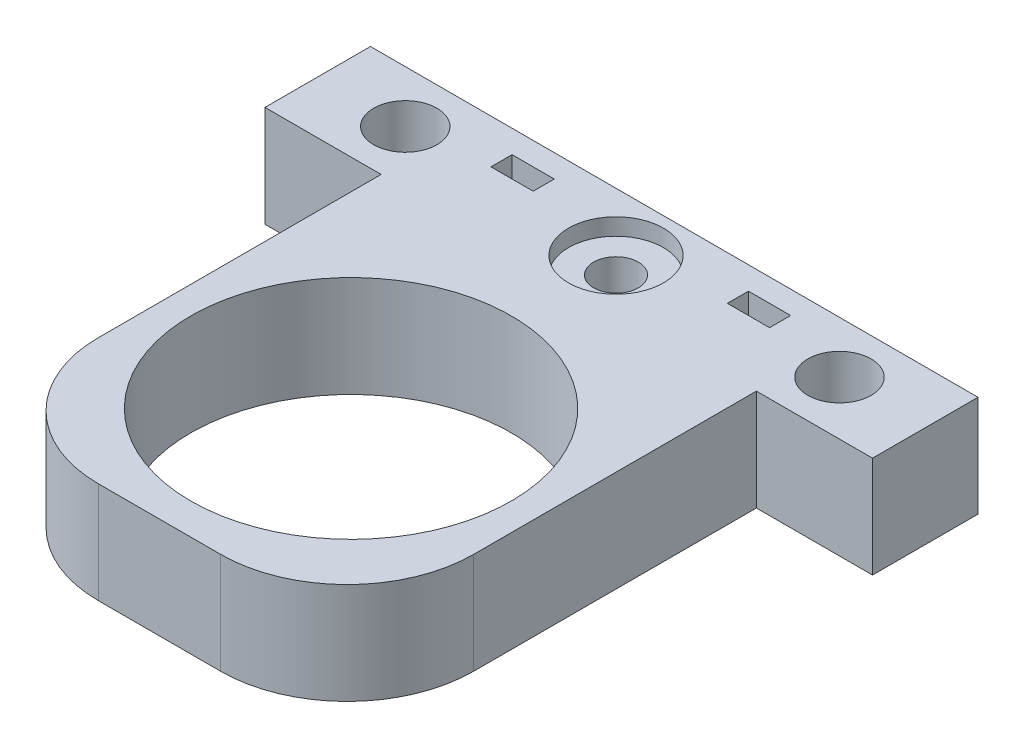
ISO-10303-21;
HEADER;
FILE_DESCRIPTION(('STEP AP214'),'2;1');
FILE_NAME('part.step','',(''),(''),'','','');
FILE_SCHEMA(('AUTOMOTIVE_DESIGN { 1 0 10303 214 1 1 1 1 }'));
ENDSEC;
DATA;
#1=APPLICATION_CONTEXT('core data for automotive mechanical design processes');
#2=APPLICATION_PROTOCOL_DEFINITION('international standard','automotive_design',2000,#1);
#3=PRODUCT_CONTEXT('',#1,'mechanical');
#4=PRODUCT('Part','Part','',(#3));
#5=PRODUCT_RELATED_PRODUCT_CATEGORY('part','',(#4));
#6=PRODUCT_DEFINITION_FORMATION('','',#4);
#7=PRODUCT_DEFINITION_CONTEXT('part definition',#1,'design');
#8=PRODUCT_DEFINITION('design','',#6,#7);
#9=PRODUCT_DEFINITION_SHAPE('','',#8);
#10=(LENGTH_UNIT() NAMED_UNIT(*) SI_UNIT(.MILLI.,.METRE.));
#11=(NAMED_UNIT(*) PLANE_ANGLE_UNIT() SI_UNIT($,.RADIAN.));
#12=(NAMED_UNIT(*) SI_UNIT($,.STERADIAN.) SOLID_ANGLE_UNIT());
#13=UNCERTAINTY_MEASURE_WITH_UNIT(LENGTH_MEASURE(1.E-05),#10,'distance_accuracy_value','');
#14=(GEOMETRIC_REPRESENTATION_CONTEXT(3) GLOBAL_UNCERTAINTY_ASSIGNED_CONTEXT((#13)) GLOBAL_UNIT_ASSIGNED_CONTEXT((#10,
#11,#12)) REPRESENTATION_CONTEXT('',''));
#15=CARTESIAN_POINT('',(0.,0.,0.));
#16=DIRECTION('',(0.,0.,1.));
#17=DIRECTION('',(1.,0.,0.));
#18=AXIS2_PLACEMENT_3D('',#15,#16,#17);
#19=CARTESIAN_POINT('',(0.,20.,-11.2));
#20=DIRECTION('',(0.,1.,0.));
#21=DIRECTION('',(0.,0.,1.));
#22=AXIS2_PLACEMENT_3D('',#19,#20,#21);
#23=CYLINDRICAL_SURFACE('',#22,5.3);
#24=CARTESIAN_POINT('',(0.,20.,-11.2));
#25=DIRECTION('',(0.,1.,0.));
#26=DIRECTION('',(0.,0.,1.));
#27=AXIS2_PLACEMENT_3D('',#24,#25,#26);
#28=CIRCLE('',#27,5.3);
#29=CARTESIAN_POINT('',(0.,20.,-5.90000000000002));
#30=VERTEX_POINT('',#29);
#31=EDGE_CURVE('E175',#30,#30,#28,.T.);
#32=ORIENTED_EDGE('',*,*,#31,.F.);
#33=EDGE_LOOP('',(#32));
#34=FACE_BOUND('',#33,.T.);
#35=CARTESIAN_POINT('',(0.,40.,-11.2));
#36=DIRECTION('',(0.,1.,0.));
#37=DIRECTION('',(0.,0.,1.));
#38=AXIS2_PLACEMENT_3D('',#35,#36,#37);
#39=CIRCLE('',#38,5.3);
#40=CARTESIAN_POINT('',(0.,40.,-5.90000000000002));
#41=VERTEX_POINT('',#40);
#42=EDGE_CURVE('E301',#41,#41,#39,.F.);
#43=ORIENTED_EDGE('',*,*,#42,.F.);
#44=EDGE_LOOP('',(#43));
#45=FACE_BOUND('',#44,.T.);
#46=ADVANCED_FACE('F39',(#34,#45),#23,.F.);
#47=CARTESIAN_POINT('',(-65.,60.,-25.));
#48=DIRECTION('',(0.,0.,1.));
#49=DIRECTION('',(1.,0.,0.));
#50=AXIS2_PLACEMENT_3D('',#47,#48,#49);
#51=PLANE('',#50);
#52=DIRECTION('',(-1.,0.,0.));
#53=VECTOR('',#52,1.);
#54=CARTESIAN_POINT('',(-72.,44.,-25.));
#55=LINE('',#54,#53);
#56=CARTESIAN_POINT('',(72.,44.,-25.));
#57=VERTEX_POINT('',#56);
#58=CARTESIAN_POINT('',(-72.,44.,-25.));
#59=VERTEX_POINT('',#58);
#60=EDGE_CURVE('E170',#57,#59,#55,.T.);
#61=ORIENTED_EDGE('',*,*,#60,.F.);
#62=DIRECTION('',(0.,1.,0.));
#63=VECTOR('',#62,1.);
#64=CARTESIAN_POINT('',(72.,60.,-25.));
#65=LINE('',#64,#63);
#66=CARTESIAN_POINT('',(72.,20.,-25.));
#67=VERTEX_POINT('',#66);
#68=EDGE_CURVE('E206',#67,#57,#65,.T.);
#69=ORIENTED_EDGE('',*,*,#68,.F.);
#70=DIRECTION('',(1.,0.,0.));
#71=VECTOR('',#70,1.);
#72=CARTESIAN_POINT('',(-65.,20.,-25.));
#73=LINE('',#72,#71);
#74=CARTESIAN_POINT('',(-72.,20.,-25.));
#75=VERTEX_POINT('',#74);
#76=EDGE_CURVE('E217',#75,#67,#73,.T.);
#77=ORIENTED_EDGE('',*,*,#76,.F.);
#78=DIRECTION('',(0.,-1.,0.));
#79=VECTOR('',#78,1.);
#80=CARTESIAN_POINT('',(-72.,60.,-25.));
#81=LINE('',#80,#79);
#82=EDGE_CURVE('E199',#59,#75,#81,.T.);
#83=ORIENTED_EDGE('',*,*,#82,.F.);
#84=EDGE_LOOP('',(#61,#69,#77,#83));
#85=FACE_BOUND('',#84,.T.);
#86=ADVANCED_FACE('F350',(#85),#51,.F.);
#87=CARTESIAN_POINT('',(51.4526055476511,0.,-12.7142223868873));
#88=DIRECTION('',(0.,1.,0.));
#89=DIRECTION('',(0.,0.,1.));
#90=AXIS2_PLACEMENT_3D('',#87,#88,#89);
#91=CYLINDRICAL_SURFACE('',#90,7.5);
#92=CARTESIAN_POINT('',(51.4526055476511,20.,-12.7142223868873));
#93=DIRECTION('',(0.,-1.,0.));
#94=DIRECTION('',(0.,0.,-1.));
#95=AXIS2_PLACEMENT_3D('',#92,#93,#94);
#96=CIRCLE('',#95,7.5);
#97=CARTESIAN_POINT('',(51.4526055476511,20.,-20.2142223868873));
#98=VERTEX_POINT('',#97);
#99=EDGE_CURVE('E251',#98,#98,#96,.F.);
#100=ORIENTED_EDGE('',*,*,#99,.F.);
#101=EDGE_LOOP('',(#100));
#102=FACE_BOUND('',#101,.T.);
#103=CARTESIAN_POINT('',(51.4526055476511,44.,-12.7142223868873));
#104=DIRECTION('',(0.,1.,0.));
#105=DIRECTION('',(0.,0.,1.));
#106=AXIS2_PLACEMENT_3D('',#103,#104,#105);
#107=CIRCLE('',#106,7.5);
#108=CARTESIAN_POINT('',(51.4526055476511,44.,-5.21422238688734));
#109=VERTEX_POINT('',#108);
#110=EDGE_CURVE('E392',#109,#109,#107,.F.);
#111=ORIENTED_EDGE('',*,*,#110,.F.);
#112=EDGE_LOOP('',(#111));
#113=FACE_BOUND('',#112,.T.);
#114=ADVANCED_FACE('F399',(#102,#113),#91,.F.);
#115=CARTESIAN_POINT('',(-51.4526055476511,0.,-12.7142223868873));
#116=DIRECTION('',(0.,1.,0.));
#117=DIRECTION('',(0.,0.,1.));
#118=AXIS2_PLACEMENT_3D('',#115,#116,#117);
#119=CYLINDRICAL_SURFACE('',#118,7.5);
#120=CARTESIAN_POINT('',(-51.4526055476511,20.,-12.7142223868873));
#121=DIRECTION('',(0.,-1.,0.));
#122=DIRECTION('',(0.,0.,-1.));
#123=AXIS2_PLACEMENT_3D('',#120,#121,#122);
#124=CIRCLE('',#123,7.5);
#125=CARTESIAN_POINT('',(-51.4526055476511,20.,-20.2142223868873));
#126=VERTEX_POINT('',#125);
#127=EDGE_CURVE('E247',#126,#126,#124,.F.);
#128=ORIENTED_EDGE('',*,*,#127,.F.);
#129=EDGE_LOOP('',(#128));
#130=FACE_BOUND('',#129,.T.);
#131=CARTESIAN_POINT('',(-51.4526055476511,44.,-12.7142223868873));
#132=DIRECTION('',(0.,1.,0.));
#133=DIRECTION('',(0.,0.,1.));
#134=AXIS2_PLACEMENT_3D('',#131,#132,#133);
#135=CIRCLE('',#134,7.5);
#136=CARTESIAN_POINT('',(-51.4526055476511,44.,-5.21422238688734));
#137=VERTEX_POINT('',#136);
#138=EDGE_CURVE('E388',#137,#137,#135,.F.);
#139=ORIENTED_EDGE('',*,*,#138,.F.);
#140=EDGE_LOOP('',(#139));
#141=FACE_BOUND('',#140,.T.);
#142=ADVANCED_FACE('F401',(#130,#141),#119,.F.);
#143=CARTESIAN_POINT('',(-33.01308524261,0.,-19.5794065637342));
#144=DIRECTION('',(-1.,0.,0.));
#145=DIRECTION('',(0.,0.,1.));
#146=AXIS2_PLACEMENT_3D('',#143,#144,#145);
#147=PLANE('',#146);
#148=DIRECTION('',(0.,0.,-1.));
#149=VECTOR('',#148,1.);
#150=CARTESIAN_POINT('',(-33.01308524261,44.,-19.5794065637342));
#151=LINE('',#150,#149);
#152=CARTESIAN_POINT('',(-33.01308524261,44.,-14.5794065637342));
#153=VERTEX_POINT('',#152);
#154=CARTESIAN_POINT('',(-33.01308524261,44.,-19.5794065637342));
#155=VERTEX_POINT('',#154);
#156=EDGE_CURVE('E385',#153,#155,#151,.T.);
#157=ORIENTED_EDGE('',*,*,#156,.F.);
#158=DIRECTION('',(0.,1.,0.));
#159=VECTOR('',#158,1.);
#160=CARTESIAN_POINT('',(-33.01308524261,0.,-14.5794065637342));
#161=LINE('',#160,#159);
#162=CARTESIAN_POINT('',(-33.01308524261,20.,-14.5794065637342));
#163=VERTEX_POINT('',#162);
#164=EDGE_CURVE('E260',#163,#153,#161,.T.);
#165=ORIENTED_EDGE('',*,*,#164,.F.);
#166=DIRECTION('',(0.,0.,1.));
#167=VECTOR('',#166,1.);
#168=CARTESIAN_POINT('',(-33.01308524261,20.,-19.5794065637342));
#169=LINE('',#168,#167);
#170=CARTESIAN_POINT('',(-33.01308524261,20.,-19.5794065637342));
#171=VERTEX_POINT('',#170);
#172=EDGE_CURVE('E244',#171,#163,#169,.T.);
#173=ORIENTED_EDGE('',*,*,#172,.F.);
#174=DIRECTION('',(0.,1.,0.));
#175=VECTOR('',#174,1.);
#176=CARTESIAN_POINT('',(-33.01308524261,0.,-19.5794065637342));
#177=LINE('',#176,#175);
#178=EDGE_CURVE('E272',#171,#155,#177,.T.);
#179=ORIENTED_EDGE('',*,*,#178,.T.);
#180=EDGE_LOOP('',(#157,#165,#173,#179));
#181=FACE_BOUND('',#180,.T.);
#182=ADVANCED_FACE('F408',(#181),#147,.F.);
#183=CARTESIAN_POINT('',(-33.01308524261,0.,-19.5794065637342));
#184=DIRECTION('',(0.,0.,-1.));
#185=DIRECTION('',(-1.,0.,0.));
#186=AXIS2_PLACEMENT_3D('',#183,#184,#185);
#187=PLANE('',#186);
#188=DIRECTION('',(1.,0.,0.));
#189=VECTOR('',#188,1.);
#190=CARTESIAN_POINT('',(-33.01308524261,44.,-19.5794065637342));
#191=LINE('',#190,#189);
#192=CARTESIAN_POINT('',(-23.01308524261,44.,-19.5794065637342));
#193=VERTEX_POINT('',#192);
#194=EDGE_CURVE('E382',#155,#193,#191,.T.);
#195=ORIENTED_EDGE('',*,*,#194,.F.);
#196=ORIENTED_EDGE('',*,*,#178,.F.);
#197=DIRECTION('',(-1.,0.,0.));
#198=VECTOR('',#197,1.);
#199=CARTESIAN_POINT('',(-33.01308524261,20.,-19.5794065637342));
#200=LINE('',#199,#198);
#201=CARTESIAN_POINT('',(-23.01308524261,20.,-19.5794065637342));
#202=VERTEX_POINT('',#201);
#203=EDGE_CURVE('E241',#202,#171,#200,.T.);
#204=ORIENTED_EDGE('',*,*,#203,.F.);
#205=DIRECTION('',(0.,1.,0.));
#206=VECTOR('',#205,1.);
#207=CARTESIAN_POINT('',(-23.01308524261,0.,-19.5794065637342));
#208=LINE('',#207,#206);
#209=EDGE_CURVE('E277',#202,#193,#208,.T.);
#210=ORIENTED_EDGE('',*,*,#209,.T.);
#211=EDGE_LOOP('',(#195,#196,#204,#210));
#212=FACE_BOUND('',#211,.T.);
#213=ADVANCED_FACE('F467',(#212),#187,.F.);
#214=CARTESIAN_POINT('',(-23.01308524261,0.,-19.5794065637342));
#215=DIRECTION('',(1.,0.,0.));
#216=DIRECTION('',(0.,0.,-1.));
#217=AXIS2_PLACEMENT_3D('',#214,#215,#216);
#218=PLANE('',#217);
#219=DIRECTION('',(0.,0.,1.));
#220=VECTOR('',#219,1.);
#221=CARTESIAN_POINT('',(-23.01308524261,44.,-19.5794065637342));
#222=LINE('',#221,#220);
#223=CARTESIAN_POINT('',(-23.01308524261,44.,-14.5794065637342));
#224=VERTEX_POINT('',#223);
#225=EDGE_CURVE('E379',#193,#224,#222,.T.);
#226=ORIENTED_EDGE('',*,*,#225,.F.);
#227=ORIENTED_EDGE('',*,*,#209,.F.);
#228=DIRECTION('',(0.,0.,-1.));
#229=VECTOR('',#228,1.);
#230=CARTESIAN_POINT('',(-23.01308524261,20.,-19.5794065637342));
#231=LINE('',#230,#229);
#232=CARTESIAN_POINT('',(-23.01308524261,20.,-14.5794065637342));
#233=VERTEX_POINT('',#232);
#234=EDGE_CURVE('E238',#233,#202,#231,.T.);
#235=ORIENTED_EDGE('',*,*,#234,.F.);
#236=DIRECTION('',(0.,1.,0.));
#237=VECTOR('',#236,1.);
#238=CARTESIAN_POINT('',(-23.01308524261,0.,-14.5794065637342));
#239=LINE('',#238,#237);
#240=EDGE_CURVE('E281',#233,#224,#239,.T.);
#241=ORIENTED_EDGE('',*,*,#240,.T.);
#242=EDGE_LOOP('',(#226,#227,#235,#241));
#243=FACE_BOUND('',#242,.T.);
#244=ADVANCED_FACE('F470',(#243),#218,.F.);
#245=CARTESIAN_POINT('',(-33.01308524261,0.,-14.5794065637342));
#246=DIRECTION('',(0.,0.,1.));
#247=DIRECTION('',(1.,0.,0.));
#248=AXIS2_PLACEMENT_3D('',#245,#246,#247);
#249=PLANE('',#248);
#250=DIRECTION('',(-1.,0.,0.));
#251=VECTOR('',#250,1.);
#252=CARTESIAN_POINT('',(-33.01308524261,44.,-14.5794065637342));
#253=LINE('',#252,#251);
#254=EDGE_CURVE('E376',#224,#153,#253,.T.);
#255=ORIENTED_EDGE('',*,*,#254,.F.);
#256=ORIENTED_EDGE('',*,*,#240,.F.);
#257=DIRECTION('',(1.,0.,0.));
#258=VECTOR('',#257,1.);
#259=CARTESIAN_POINT('',(-33.01308524261,20.,-14.5794065637342));
#260=LINE('',#259,#258);
#261=EDGE_CURVE('E235',#163,#233,#260,.T.);
#262=ORIENTED_EDGE('',*,*,#261,.F.);
#263=ORIENTED_EDGE('',*,*,#164,.T.);
#264=EDGE_LOOP('',(#255,#256,#262,#263));
#265=FACE_BOUND('',#264,.T.);
#266=ADVANCED_FACE('F465',(#265),#249,.F.);
#267=CARTESIAN_POINT('',(33.01308524261,0.,-19.5794065637342));
#268=DIRECTION('',(0.,0.,-1.));
#269=DIRECTION('',(-1.,0.,0.));
#270=AXIS2_PLACEMENT_3D('',#267,#268,#269);
#271=PLANE('',#270);
#272=DIRECTION('',(1.,0.,0.));
#273=VECTOR('',#272,1.);
#274=CARTESIAN_POINT('',(33.01308524261,44.,-19.5794065637342));
#275=LINE('',#274,#273);
#276=CARTESIAN_POINT('',(23.01308524261,44.,-19.5794065637342));
#277=VERTEX_POINT('',#276);
#278=CARTESIAN_POINT('',(33.01308524261,44.,-19.5794065637342));
#279=VERTEX_POINT('',#278);
#280=EDGE_CURVE('E373',#277,#279,#275,.T.);
#281=ORIENTED_EDGE('',*,*,#280,.F.);
#282=DIRECTION('',(0.,1.,0.));
#283=VECTOR('',#282,1.);
#284=CARTESIAN_POINT('',(23.01308524261,0.,-19.5794065637342));
#285=LINE('',#284,#283);
#286=CARTESIAN_POINT('',(23.01308524261,20.,-19.5794065637342));
#287=VERTEX_POINT('',#286);
#288=EDGE_CURVE('E255',#287,#277,#285,.T.);
#289=ORIENTED_EDGE('',*,*,#288,.F.);
#290=DIRECTION('',(-1.,0.,0.));
#291=VECTOR('',#290,1.);
#292=CARTESIAN_POINT('',(33.01308524261,20.,-19.5794065637342));
#293=LINE('',#292,#291);
#294=CARTESIAN_POINT('',(33.01308524261,20.,-19.5794065637342));
#295=VERTEX_POINT('',#294);
#296=EDGE_CURVE('E232',#295,#287,#293,.T.);
#297=ORIENTED_EDGE('',*,*,#296,.F.);
#298=DIRECTION('',(0.,1.,0.));
#299=VECTOR('',#298,1.);
#300=CARTESIAN_POINT('',(33.01308524261,0.,-19.5794065637342));
#301=LINE('',#300,#299);
#302=EDGE_CURVE('E256',#295,#279,#301,.T.);
#303=ORIENTED_EDGE('',*,*,#302,.T.);
#304=EDGE_LOOP('',(#281,#289,#297,#303));
#305=FACE_BOUND('',#304,.T.);
#306=ADVANCED_FACE('F455',(#305),#271,.F.);
#307=CARTESIAN_POINT('',(33.01308524261,0.,-19.5794065637342));
#308=DIRECTION('',(1.,0.,0.));
#309=DIRECTION('',(0.,0.,-1.));
#310=AXIS2_PLACEMENT_3D('',#307,#308,#309);
#311=PLANE('',#310);
#312=DIRECTION('',(0.,0.,1.));
#313=VECTOR('',#312,1.);
#314=CARTESIAN_POINT('',(33.01308524261,44.,-19.5794065637342));
#315=LINE('',#314,#313);
#316=CARTESIAN_POINT('',(33.01308524261,44.,-14.5794065637342));
#317=VERTEX_POINT('',#316);
#318=EDGE_CURVE('E370',#279,#317,#315,.T.);
#319=ORIENTED_EDGE('',*,*,#318,.F.);
#320=ORIENTED_EDGE('',*,*,#302,.F.);
#321=DIRECTION('',(0.,0.,-1.));
#322=VECTOR('',#321,1.);
#323=CARTESIAN_POINT('',(33.01308524261,20.,-19.5794065637342));
#324=LINE('',#323,#322);
#325=CARTESIAN_POINT('',(33.01308524261,20.,-14.5794065637342));
#326=VERTEX_POINT('',#325);
#327=EDGE_CURVE('E229',#326,#295,#324,.T.);
#328=ORIENTED_EDGE('',*,*,#327,.F.);
#329=DIRECTION('',(0.,1.,0.));
#330=VECTOR('',#329,1.);
#331=CARTESIAN_POINT('',(33.01308524261,0.,-14.5794065637342));
#332=LINE('',#331,#330);
#333=EDGE_CURVE('E261',#326,#317,#332,.T.);
#334=ORIENTED_EDGE('',*,*,#333,.T.);
#335=EDGE_LOOP('',(#319,#320,#328,#334));
#336=FACE_BOUND('',#335,.T.);
#337=ADVANCED_FACE('F451',(#336),#311,.F.);
#338=CARTESIAN_POINT('',(33.01308524261,0.,-14.5794065637342));
#339=DIRECTION('',(0.,0.,1.));
#340=DIRECTION('',(1.,0.,0.));
#341=AXIS2_PLACEMENT_3D('',#338,#339,#340);
#342=PLANE('',#341);
#343=DIRECTION('',(-1.,0.,0.));
#344=VECTOR('',#343,1.);
#345=CARTESIAN_POINT('',(33.01308524261,44.,-14.5794065637342));
#346=LINE('',#345,#344);
#347=CARTESIAN_POINT('',(23.01308524261,44.,-14.5794065637342));
#348=VERTEX_POINT('',#347);
#349=EDGE_CURVE('E367',#317,#348,#346,.T.);
#350=ORIENTED_EDGE('',*,*,#349,.F.);
#351=ORIENTED_EDGE('',*,*,#333,.F.);
#352=DIRECTION('',(1.,0.,0.));
#353=VECTOR('',#352,1.);
#354=CARTESIAN_POINT('',(33.01308524261,20.,-14.5794065637342));
#355=LINE('',#354,#353);
#356=CARTESIAN_POINT('',(23.01308524261,20.,-14.5794065637342));
#357=VERTEX_POINT('',#356);
#358=EDGE_CURVE('E226',#357,#326,#355,.T.);
#359=ORIENTED_EDGE('',*,*,#358,.F.);
#360=DIRECTION('',(0.,1.,0.));
#361=VECTOR('',#360,1.);
#362=CARTESIAN_POINT('',(23.01308524261,0.,-14.5794065637342));
#363=LINE('',#362,#361);
#364=EDGE_CURVE('E265',#357,#348,#363,.T.);
#365=ORIENTED_EDGE('',*,*,#364,.T.);
#366=EDGE_LOOP('',(#350,#351,#359,#365));
#367=FACE_BOUND('',#366,.T.);
#368=ADVANCED_FACE('F454',(#367),#342,.F.);
#369=CARTESIAN_POINT('',(23.01308524261,0.,-19.5794065637342));
#370=DIRECTION('',(-1.,0.,0.));
#371=DIRECTION('',(0.,0.,1.));
#372=AXIS2_PLACEMENT_3D('',#369,#370,#371);
#373=PLANE('',#372);
#374=DIRECTION('',(0.,0.,-1.));
#375=VECTOR('',#374,1.);
#376=CARTESIAN_POINT('',(23.01308524261,44.,-19.5794065637342));
#377=LINE('',#376,#375);
#378=EDGE_CURVE('E185',#348,#277,#377,.T.);
#379=ORIENTED_EDGE('',*,*,#378,.F.);
#380=ORIENTED_EDGE('',*,*,#364,.F.);
#381=DIRECTION('',(0.,0.,1.));
#382=VECTOR('',#381,1.);
#383=CARTESIAN_POINT('',(23.01308524261,20.,-19.5794065637342));
#384=LINE('',#383,#382);
#385=EDGE_CURVE('E223',#287,#357,#384,.T.);
#386=ORIENTED_EDGE('',*,*,#385,.F.);
#387=ORIENTED_EDGE('',*,*,#288,.T.);
#388=EDGE_LOOP('',(#379,#380,#386,#387));
#389=FACE_BOUND('',#388,.T.);
#390=ADVANCED_FACE('F443',(#389),#373,.F.);
#391=CARTESIAN_POINT('',(44.4743587222466,15.,0.));
#392=DIRECTION('',(-1.,0.,0.));
#393=DIRECTION('',(0.,0.,1.));
#394=AXIS2_PLACEMENT_3D('',#391,#392,#393);
#395=PLANE('',#394);
#396=DIRECTION('',(0.,0.,-1.));
#397=VECTOR('',#396,1.);
#398=CARTESIAN_POINT('',(44.4743587222466,44.,0.));
#399=LINE('',#398,#397);
#400=CARTESIAN_POINT('',(44.4743587222466,44.,67.));
#401=VERTEX_POINT('',#400);
#402=CARTESIAN_POINT('',(44.4743587222466,44.,0.));
#403=VERTEX_POINT('',#402);
#404=EDGE_CURVE('E333',#401,#403,#399,.T.);
#405=ORIENTED_EDGE('',*,*,#404,.F.);
#406=DIRECTION('',(0.,1.,0.));
#407=VECTOR('',#406,1.);
#408=CARTESIAN_POINT('',(44.4743587222466,20.,67.));
#409=LINE('',#408,#407);
#410=CARTESIAN_POINT('',(44.4743587222466,20.,67.));
#411=VERTEX_POINT('',#410);
#412=EDGE_CURVE('E11',#401,#411,#409,.F.);
#413=ORIENTED_EDGE('',*,*,#412,.T.);
#414=DIRECTION('',(0.,0.,-1.));
#415=VECTOR('',#414,1.);
#416=CARTESIAN_POINT('',(44.4743587222466,20.,0.));
#417=LINE('',#416,#415);
#418=CARTESIAN_POINT('',(44.4743587222466,20.,0.));
#419=VERTEX_POINT('',#418);
#420=EDGE_CURVE('E291',#411,#419,#417,.T.);
#421=ORIENTED_EDGE('',*,*,#420,.T.);
#422=DIRECTION('',(0.,1.,0.));
#423=VECTOR('',#422,1.);
#424=CARTESIAN_POINT('',(44.4743587222466,15.,0.));
#425=LINE('',#424,#423);
#426=EDGE_CURVE('E214',#419,#403,#425,.T.);
#427=ORIENTED_EDGE('',*,*,#426,.T.);
#428=EDGE_LOOP('',(#405,#413,#421,#427));
#429=FACE_BOUND('',#428,.T.);
#430=ADVANCED_FACE('F440',(#429),#395,.F.);
#431=CARTESIAN_POINT('',(65.,15.,0.));
#432=DIRECTION('',(0.,0.,-1.));
#433=DIRECTION('',(-1.,0.,0.));
#434=AXIS2_PLACEMENT_3D('',#431,#432,#433);
#435=PLANE('',#434);
#436=DIRECTION('',(1.,0.,0.));
#437=VECTOR('',#436,1.);
#438=CARTESIAN_POINT('',(65.,44.,0.));
#439=LINE('',#438,#437);
#440=CARTESIAN_POINT('',(72.,44.,0.));
#441=VERTEX_POINT('',#440);
#442=EDGE_CURVE('E355',#403,#441,#439,.T.);
#443=ORIENTED_EDGE('',*,*,#442,.F.);
#444=ORIENTED_EDGE('',*,*,#426,.F.);
#445=DIRECTION('',(1.,0.,0.));
#446=VECTOR('',#445,1.);
#447=CARTESIAN_POINT('',(0.,20.,0.));
#448=LINE('',#447,#446);
#449=CARTESIAN_POINT('',(72.,20.,0.));
#450=VERTEX_POINT('',#449);
#451=EDGE_CURVE('E276',#419,#450,#448,.T.);
#452=ORIENTED_EDGE('',*,*,#451,.T.);
#453=DIRECTION('',(0.,-1.,0.));
#454=VECTOR('',#453,1.);
#455=CARTESIAN_POINT('',(72.,60.,0.));
#456=LINE('',#455,#454);
#457=EDGE_CURVE('E193',#441,#450,#456,.T.);
#458=ORIENTED_EDGE('',*,*,#457,.F.);
#459=EDGE_LOOP('',(#443,#444,#452,#458));
#460=FACE_BOUND('',#459,.T.);
#461=ADVANCED_FACE('F437',(#460),#435,.F.);
#462=CARTESIAN_POINT('',(-65.,15.,0.));
#463=DIRECTION('',(0.,0.,-1.));
#464=DIRECTION('',(-1.,0.,0.));
#465=AXIS2_PLACEMENT_3D('',#462,#463,#464);
#466=PLANE('',#465);
#467=DIRECTION('',(1.,0.,0.));
#468=VECTOR('',#467,1.);
#469=CARTESIAN_POINT('',(-65.,44.,0.));
#470=LINE('',#469,#468);
#471=CARTESIAN_POINT('',(-72.,44.,0.));
#472=VERTEX_POINT('',#471);
#473=CARTESIAN_POINT('',(-44.4743587222466,44.,0.));
#474=VERTEX_POINT('',#473);
#475=EDGE_CURVE('E168',#472,#474,#470,.T.);
#476=ORIENTED_EDGE('',*,*,#475,.F.);
#477=DIRECTION('',(0.,1.,0.));
#478=VECTOR('',#477,1.);
#479=CARTESIAN_POINT('',(-72.,60.,0.));
#480=LINE('',#479,#478);
#481=CARTESIAN_POINT('',(-72.,20.,0.));
#482=VERTEX_POINT('',#481);
#483=EDGE_CURVE('E182',#482,#472,#480,.T.);
#484=ORIENTED_EDGE('',*,*,#483,.F.);
#485=DIRECTION('',(1.,0.,0.));
#486=VECTOR('',#485,1.);
#487=CARTESIAN_POINT('',(0.,20.,0.));
#488=LINE('',#487,#486);
#489=CARTESIAN_POINT('',(-44.4743587222466,20.,0.));
#490=VERTEX_POINT('',#489);
#491=EDGE_CURVE('E297',#482,#490,#488,.T.);
#492=ORIENTED_EDGE('',*,*,#491,.T.);
#493=DIRECTION('',(0.,1.,0.));
#494=VECTOR('',#493,1.);
#495=CARTESIAN_POINT('',(-44.4743587222466,15.,0.));
#496=LINE('',#495,#494);
#497=EDGE_CURVE('E183',#490,#474,#496,.T.);
#498=ORIENTED_EDGE('',*,*,#497,.T.);
#499=EDGE_LOOP('',(#476,#484,#492,#498));
#500=FACE_BOUND('',#499,.T.);
#501=ADVANCED_FACE('F180',(#500),#466,.F.);
#502=CARTESIAN_POINT('',(-44.4743587222466,15.,0.));
#503=DIRECTION('',(1.,0.,0.));
#504=DIRECTION('',(0.,0.,-1.));
#505=AXIS2_PLACEMENT_3D('',#502,#503,#504);
#506=PLANE('',#505);
#507=DIRECTION('',(0.,0.,1.));
#508=VECTOR('',#507,1.);
#509=CARTESIAN_POINT('',(-44.4743587222466,20.,0.));
#510=LINE('',#509,#508);
#511=CARTESIAN_POINT('',(-44.4743587222466,20.,67.));
#512=VERTEX_POINT('',#511);
#513=EDGE_CURVE('E294',#490,#512,#510,.T.);
#514=ORIENTED_EDGE('',*,*,#513,.T.);
#515=DIRECTION('',(0.,-1.,0.));
#516=VECTOR('',#515,1.);
#517=CARTESIAN_POINT('',(-44.4743587222466,44.,67.));
#518=LINE('',#517,#516);
#519=CARTESIAN_POINT('',(-44.4743587222466,44.,67.));
#520=VERTEX_POINT('',#519);
#521=EDGE_CURVE('E63',#512,#520,#518,.F.);
#522=ORIENTED_EDGE('',*,*,#521,.T.);
#523=DIRECTION('',(0.,0.,1.));
#524=VECTOR('',#523,1.);
#525=CARTESIAN_POINT('',(-44.4743587222466,44.,0.));
#526=LINE('',#525,#524);
#527=EDGE_CURVE('E186',#474,#520,#526,.T.);
#528=ORIENTED_EDGE('',*,*,#527,.F.);
#529=ORIENTED_EDGE('',*,*,#497,.F.);
#530=EDGE_LOOP('',(#514,#522,#528,#529));
#531=FACE_BOUND('',#530,.T.);
#532=ADVANCED_FACE('F340',(#531),#506,.F.);
#533=CARTESIAN_POINT('',(0.,0.,97.));
#534=DIRECTION('',(0.,0.,1.));
#535=DIRECTION('',(1.,0.,0.));
#536=AXIS2_PLACEMENT_3D('',#533,#534,#535);
#537=PLANE('',#536);
#538=DIRECTION('',(-1.,0.,0.));
#539=VECTOR('',#538,1.);
#540=CARTESIAN_POINT('',(0.,44.,97.));
#541=LINE('',#540,#539);
#542=CARTESIAN_POINT('',(14.4743587222466,44.,97.));
#543=VERTEX_POINT('',#542);
#544=CARTESIAN_POINT('',(-14.4743587222466,44.,97.));
#545=VERTEX_POINT('',#544);
#546=EDGE_CURVE('E325',#543,#545,#541,.T.);
#547=ORIENTED_EDGE('',*,*,#546,.T.);
#548=DIRECTION('',(0.,-1.,0.));
#549=VECTOR('',#548,1.);
#550=CARTESIAN_POINT('',(-14.4743587222466,20.,97.));
#551=LINE('',#550,#549);
#552=CARTESIAN_POINT('',(-14.4743587222466,20.,97.));
#553=VERTEX_POINT('',#552);
#554=EDGE_CURVE('E309',#545,#553,#551,.T.);
#555=ORIENTED_EDGE('',*,*,#554,.T.);
#556=DIRECTION('',(1.,0.,0.));
#557=VECTOR('',#556,1.);
#558=CARTESIAN_POINT('',(-44.4743587222466,20.,97.));
#559=LINE('',#558,#557);
#560=CARTESIAN_POINT('',(14.4743587222466,20.,97.));
#561=VERTEX_POINT('',#560);
#562=EDGE_CURVE('E210',#553,#561,#559,.T.);
#563=ORIENTED_EDGE('',*,*,#562,.T.);
#564=DIRECTION('',(0.,1.,0.));
#565=VECTOR('',#564,1.);
#566=CARTESIAN_POINT('',(14.4743587222466,44.,97.));
#567=LINE('',#566,#565);
#568=EDGE_CURVE('E300',#561,#543,#567,.T.);
#569=ORIENTED_EDGE('',*,*,#568,.T.);
#570=EDGE_LOOP('',(#547,#555,#563,#569));
#571=FACE_BOUND('',#570,.T.);
#572=ADVANCED_FACE('F329',(#571),#537,.T.);
#573=CARTESIAN_POINT('',(72.,0.,0.));
#574=DIRECTION('',(1.,0.,0.));
#575=DIRECTION('',(0.,0.,-1.));
#576=AXIS2_PLACEMENT_3D('',#573,#574,#575);
#577=PLANE('',#576);
#578=ORIENTED_EDGE('',*,*,#68,.T.);
#579=DIRECTION('',(0.,0.,1.));
#580=VECTOR('',#579,1.);
#581=CARTESIAN_POINT('',(72.,44.,0.));
#582=LINE('',#581,#580);
#583=EDGE_CURVE('E352',#57,#441,#582,.T.);
#584=ORIENTED_EDGE('',*,*,#583,.T.);
#585=ORIENTED_EDGE('',*,*,#457,.T.);
#586=DIRECTION('',(0.,0.,-1.));
#587=VECTOR('',#586,1.);
#588=CARTESIAN_POINT('',(72.,20.,0.));
#589=LINE('',#588,#587);
#590=EDGE_CURVE('E197',#450,#67,#589,.T.);
#591=ORIENTED_EDGE('',*,*,#590,.T.);
#592=EDGE_LOOP('',(#578,#584,#585,#591));
#593=FACE_BOUND('',#592,.T.);
#594=ADVANCED_FACE('F347',(#593),#577,.T.);
#595=CARTESIAN_POINT('',(-72.,0.,0.));
#596=DIRECTION('',(-1.,0.,0.));
#597=DIRECTION('',(0.,0.,1.));
#598=AXIS2_PLACEMENT_3D('',#595,#596,#597);
#599=PLANE('',#598);
#600=ORIENTED_EDGE('',*,*,#483,.T.);
#601=DIRECTION('',(0.,0.,1.));
#602=VECTOR('',#601,1.);
#603=CARTESIAN_POINT('',(-72.,44.,-25.));
#604=LINE('',#603,#602);
#605=EDGE_CURVE('E164',#59,#472,#604,.T.);
#606=ORIENTED_EDGE('',*,*,#605,.F.);
#607=ORIENTED_EDGE('',*,*,#82,.T.);
#608=DIRECTION('',(0.,0.,1.));
#609=VECTOR('',#608,1.);
#610=CARTESIAN_POINT('',(-72.,20.,-25.));
#611=LINE('',#610,#609);
#612=EDGE_CURVE('E191',#75,#482,#611,.T.);
#613=ORIENTED_EDGE('',*,*,#612,.T.);
#614=EDGE_LOOP('',(#600,#606,#607,#613));
#615=FACE_BOUND('',#614,.T.);
#616=ADVANCED_FACE('F189',(#615),#599,.T.);
#617=CARTESIAN_POINT('',(0.,20.,0.));
#618=DIRECTION('',(0.,-1.,0.));
#619=DIRECTION('',(0.,0.,-1.));
#620=AXIS2_PLACEMENT_3D('',#617,#618,#619);
#621=PLANE('',#620);
#622=CARTESIAN_POINT('',(0.,20.,51.5965043695381));
#623=DIRECTION('',(0.,1.,0.));
#624=DIRECTION('',(0.,0.,1.));
#625=AXIS2_PLACEMENT_3D('',#622,#623,#624);
#626=CIRCLE('',#625,38.);
#627=CARTESIAN_POINT('',(0.,20.,89.5965043695381));
#628=VERTEX_POINT('',#627);
#629=EDGE_CURVE('E706',#628,#628,#626,.T.);
#630=ORIENTED_EDGE('',*,*,#629,.T.);
#631=EDGE_LOOP('',(#630));
#632=FACE_BOUND('',#631,.T.);
#633=ORIENTED_EDGE('',*,*,#31,.T.);
#634=EDGE_LOOP('',(#633));
#635=FACE_BOUND('',#634,.T.);
#636=ORIENTED_EDGE('',*,*,#562,.F.);
#637=CARTESIAN_POINT('',(-14.4743587222466,20.,67.));
#638=DIRECTION('',(0.,-1.,0.));
#639=DIRECTION('',(0.,0.,-1.));
#640=AXIS2_PLACEMENT_3D('',#637,#638,#639);
#641=CIRCLE('',#640,30.);
#642=EDGE_CURVE('E316',#553,#512,#641,.T.);
#643=ORIENTED_EDGE('',*,*,#642,.T.);
#644=ORIENTED_EDGE('',*,*,#513,.F.);
#645=ORIENTED_EDGE('',*,*,#491,.F.);
#646=ORIENTED_EDGE('',*,*,#612,.F.);
#647=ORIENTED_EDGE('',*,*,#76,.T.);
#648=ORIENTED_EDGE('',*,*,#590,.F.);
#649=ORIENTED_EDGE('',*,*,#451,.F.);
#650=ORIENTED_EDGE('',*,*,#420,.F.);
#651=CARTESIAN_POINT('',(14.4743587222466,20.,67.));
#652=DIRECTION('',(0.,-1.,0.));
#653=DIRECTION('',(0.,0.,-1.));
#654=AXIS2_PLACEMENT_3D('',#651,#652,#653);
#655=CIRCLE('',#654,30.);
#656=EDGE_CURVE('E313',#411,#561,#655,.T.);
#657=ORIENTED_EDGE('',*,*,#656,.T.);
#658=EDGE_LOOP('',(#636,#643,#644,#645,#646,#647,#648,#649,#650,#657));
#659=FACE_BOUND('',#658,.T.);
#660=ORIENTED_EDGE('',*,*,#296,.T.);
#661=ORIENTED_EDGE('',*,*,#385,.T.);
#662=ORIENTED_EDGE('',*,*,#358,.T.);
#663=ORIENTED_EDGE('',*,*,#327,.T.);
#664=EDGE_LOOP('',(#660,#661,#662,#663));
#665=FACE_BOUND('',#664,.T.);
#666=ORIENTED_EDGE('',*,*,#172,.T.);
#667=ORIENTED_EDGE('',*,*,#261,.T.);
#668=ORIENTED_EDGE('',*,*,#234,.T.);
#669=ORIENTED_EDGE('',*,*,#203,.T.);
#670=EDGE_LOOP('',(#666,#667,#668,#669));
#671=FACE_BOUND('',#670,.T.);
#672=ORIENTED_EDGE('',*,*,#127,.T.);
#673=EDGE_LOOP('',(#672));
#674=FACE_BOUND('',#673,.T.);
#675=ORIENTED_EDGE('',*,*,#99,.T.);
#676=EDGE_LOOP('',(#675));
#677=FACE_BOUND('',#676,.T.);
#678=ADVANCED_FACE('F338',(#632,#635,#659,#665,#671,#674,#677),#621,.T.);
#679=CARTESIAN_POINT('',(0.,44.,0.));
#680=DIRECTION('',(0.,1.,0.));
#681=DIRECTION('',(0.,0.,1.));
#682=AXIS2_PLACEMENT_3D('',#679,#680,#681);
#683=PLANE('',#682);
#684=CARTESIAN_POINT('',(0.,44.,51.5965043695381));
#685=DIRECTION('',(0.,1.,0.));
#686=DIRECTION('',(0.,0.,1.));
#687=AXIS2_PLACEMENT_3D('',#684,#685,#686);
#688=CIRCLE('',#687,38.);
#689=CARTESIAN_POINT('',(0.,44.,89.5965043695381));
#690=VERTEX_POINT('',#689);
#691=EDGE_CURVE('E709',#690,#690,#688,.T.);
#692=ORIENTED_EDGE('',*,*,#691,.F.);
#693=EDGE_LOOP('',(#692));
#694=FACE_BOUND('',#693,.T.);
#695=CARTESIAN_POINT('',(0.,44.,-11.2));
#696=DIRECTION('',(0.,1.,0.));
#697=DIRECTION('',(0.,0.,1.));
#698=AXIS2_PLACEMENT_3D('',#695,#696,#697);
#699=CIRCLE('',#698,11.25);
#700=CARTESIAN_POINT('',(0.,44.,0.0499999999999858));
#701=VERTEX_POINT('',#700);
#702=EDGE_CURVE('E713',#701,#701,#699,.T.);
#703=ORIENTED_EDGE('',*,*,#702,.F.);
#704=EDGE_LOOP('',(#703));
#705=FACE_BOUND('',#704,.T.);
#706=ORIENTED_EDGE('',*,*,#280,.T.);
#707=ORIENTED_EDGE('',*,*,#318,.T.);
#708=ORIENTED_EDGE('',*,*,#349,.T.);
#709=ORIENTED_EDGE('',*,*,#378,.T.);
#710=EDGE_LOOP('',(#706,#707,#708,#709));
#711=FACE_BOUND('',#710,.T.);
#712=ORIENTED_EDGE('',*,*,#527,.T.);
#713=CARTESIAN_POINT('',(-14.4743587222466,44.,67.));
#714=DIRECTION('',(0.,1.,0.));
#715=DIRECTION('',(0.,0.,1.));
#716=AXIS2_PLACEMENT_3D('',#713,#714,#715);
#717=CIRCLE('',#716,30.);
#718=EDGE_CURVE('E48',#520,#545,#717,.T.);
#719=ORIENTED_EDGE('',*,*,#718,.T.);
#720=ORIENTED_EDGE('',*,*,#546,.F.);
#721=CARTESIAN_POINT('',(14.4743587222466,44.,67.));
#722=DIRECTION('',(0.,1.,0.));
#723=DIRECTION('',(0.,0.,1.));
#724=AXIS2_PLACEMENT_3D('',#721,#722,#723);
#725=CIRCLE('',#724,30.);
#726=EDGE_CURVE('E55',#543,#401,#725,.T.);
#727=ORIENTED_EDGE('',*,*,#726,.T.);
#728=ORIENTED_EDGE('',*,*,#404,.T.);
#729=ORIENTED_EDGE('',*,*,#442,.T.);
#730=ORIENTED_EDGE('',*,*,#583,.F.);
#731=ORIENTED_EDGE('',*,*,#60,.T.);
#732=ORIENTED_EDGE('',*,*,#605,.T.);
#733=ORIENTED_EDGE('',*,*,#475,.T.);
#734=EDGE_LOOP('',(#712,#719,#720,#727,#728,#729,#730,#731,#732,#733));
#735=FACE_BOUND('',#734,.T.);
#736=ORIENTED_EDGE('',*,*,#156,.T.);
#737=ORIENTED_EDGE('',*,*,#194,.T.);
#738=ORIENTED_EDGE('',*,*,#225,.T.);
#739=ORIENTED_EDGE('',*,*,#254,.T.);
#740=EDGE_LOOP('',(#736,#737,#738,#739));
#741=FACE_BOUND('',#740,.T.);
#742=ORIENTED_EDGE('',*,*,#138,.T.);
#743=EDGE_LOOP('',(#742));
#744=FACE_BOUND('',#743,.T.);
#745=ORIENTED_EDGE('',*,*,#110,.T.);
#746=EDGE_LOOP('',(#745));
#747=FACE_BOUND('',#746,.T.);
#748=ADVANCED_FACE('F166',(#694,#705,#711,#735,#741,#744,#747),#683,.T.);
#749=CARTESIAN_POINT('',(0.,40.,-11.2));
#750=DIRECTION('',(0.,1.,0.));
#751=DIRECTION('',(0.,0.,1.));
#752=AXIS2_PLACEMENT_3D('',#749,#750,#751);
#753=PLANE('',#752);
#754=CARTESIAN_POINT('',(0.,40.,-11.2));
#755=DIRECTION('',(0.,1.,0.));
#756=DIRECTION('',(0.,0.,1.));
#757=AXIS2_PLACEMENT_3D('',#754,#755,#756);
#758=CIRCLE('',#757,11.25);
#759=CARTESIAN_POINT('',(0.,40.,0.0499999999999858));
#760=VERTEX_POINT('',#759);
#761=EDGE_CURVE('E305',#760,#760,#758,.T.);
#762=ORIENTED_EDGE('',*,*,#761,.T.);
#763=EDGE_LOOP('',(#762));
#764=FACE_BOUND('',#763,.T.);
#765=ORIENTED_EDGE('',*,*,#42,.T.);
#766=EDGE_LOOP('',(#765));
#767=FACE_BOUND('',#766,.T.);
#768=ADVANCED_FACE('F427',(#764,#767),#753,.T.);
#769=CARTESIAN_POINT('',(0.,40.,-11.2));
#770=DIRECTION('',(0.,1.,0.));
#771=DIRECTION('',(0.,0.,1.));
#772=AXIS2_PLACEMENT_3D('',#769,#770,#771);
#773=CYLINDRICAL_SURFACE('',#772,11.25);
#774=ORIENTED_EDGE('',*,*,#761,.F.);
#775=EDGE_LOOP('',(#774));
#776=FACE_BOUND('',#775,.T.);
#777=ORIENTED_EDGE('',*,*,#702,.T.);
#778=EDGE_LOOP('',(#777));
#779=FACE_BOUND('',#778,.T.);
#780=ADVANCED_FACE('F423',(#776,#779),#773,.F.);
#781=CARTESIAN_POINT('',(0.,20.,51.5965043695381));
#782=DIRECTION('',(0.,1.,0.));
#783=DIRECTION('',(0.,0.,1.));
#784=AXIS2_PLACEMENT_3D('',#781,#782,#783);
#785=CYLINDRICAL_SURFACE('',#784,38.);
#786=ORIENTED_EDGE('',*,*,#629,.F.);
#787=EDGE_LOOP('',(#786));
#788=FACE_BOUND('',#787,.T.);
#789=ORIENTED_EDGE('',*,*,#691,.T.);
#790=EDGE_LOOP('',(#789));
#791=FACE_BOUND('',#790,.T.);
#792=ADVANCED_FACE('F580',(#788,#791),#785,.F.);
#793=CARTESIAN_POINT('',(-14.4743587222466,0.,67.));
#794=DIRECTION('',(0.,1.,0.));
#795=DIRECTION('',(0.,0.,1.));
#796=AXIS2_PLACEMENT_3D('',#793,#794,#795);
#797=CYLINDRICAL_SURFACE('',#796,30.);
#798=ORIENTED_EDGE('',*,*,#718,.F.);
#799=ORIENTED_EDGE('',*,*,#521,.F.);
#800=ORIENTED_EDGE('',*,*,#642,.F.);
#801=ORIENTED_EDGE('',*,*,#554,.F.);
#802=EDGE_LOOP('',(#798,#799,#800,#801));
#803=FACE_BOUND('',#802,.T.);
#804=ADVANCED_FACE('F335',(#803),#797,.T.);
#805=CARTESIAN_POINT('',(14.4743587222466,0.,67.));
#806=DIRECTION('',(0.,-1.,0.));
#807=DIRECTION('',(0.,0.,-1.));
#808=AXIS2_PLACEMENT_3D('',#805,#806,#807);
#809=CYLINDRICAL_SURFACE('',#808,30.);
#810=ORIENTED_EDGE('',*,*,#656,.F.);
#811=ORIENTED_EDGE('',*,*,#412,.F.);
#812=ORIENTED_EDGE('',*,*,#726,.F.);
#813=ORIENTED_EDGE('',*,*,#568,.F.);
#814=EDGE_LOOP('',(#810,#811,#812,#813));
#815=FACE_BOUND('',#814,.T.);
#816=ADVANCED_FACE('F41',(#815),#809,.T.);
#817=CLOSED_SHELL('',(#46,#86,#114,#142,#182,#213,#244,#266,#306,#337,#368,#390,#430,#461,#501,
#532,#572,#594,#616,#678,#748,#768,#780,#792,#804,#816));
#818=MANIFOLD_SOLID_BREP('B2',#817);
#819=ADVANCED_BREP_SHAPE_REPRESENTATION('',(#18,#818),#14);
#820=SHAPE_DEFINITION_REPRESENTATION(#9,#819);
ENDSEC;
END-ISO-10303-21;
